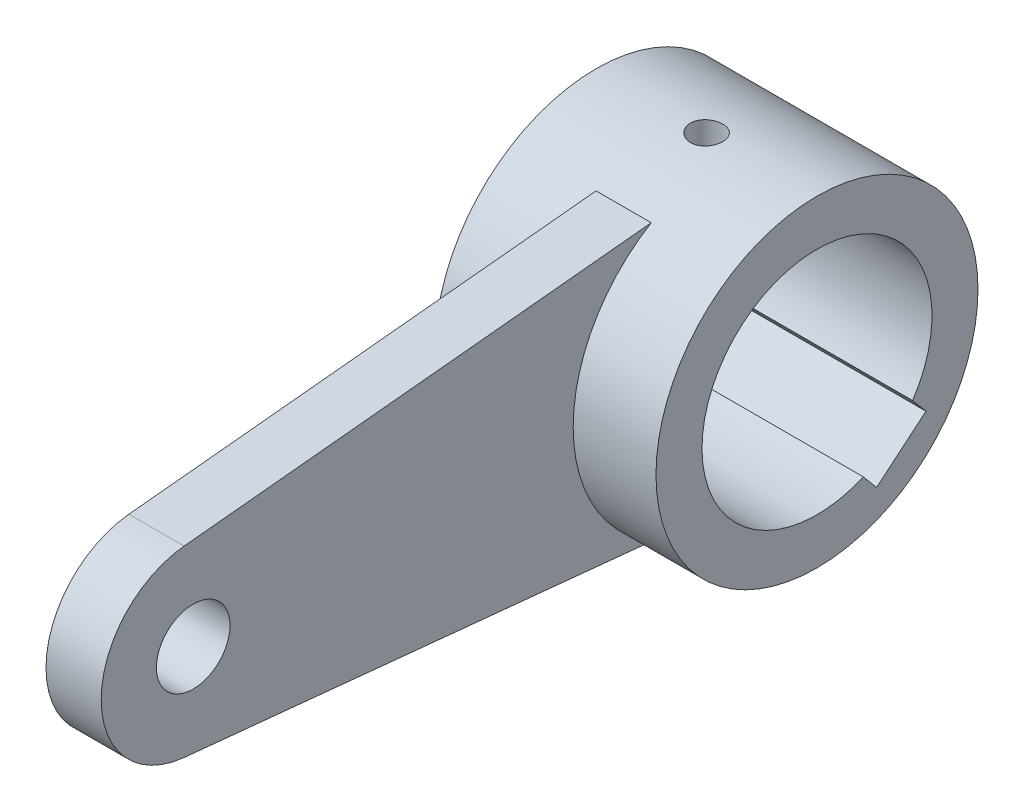
ISO-10303-21;
HEADER;
FILE_DESCRIPTION(('STEP AP214'),'2;1');
FILE_NAME('part.step','',(''),(''),'','','');
FILE_SCHEMA(('AUTOMOTIVE_DESIGN { 1 0 10303 214 1 1 1 1 }'));
ENDSEC;
DATA;
#1=APPLICATION_CONTEXT('core data for automotive mechanical design processes');
#2=APPLICATION_PROTOCOL_DEFINITION('international standard','automotive_design',2000,#1);
#3=PRODUCT_CONTEXT('',#1,'mechanical');
#4=PRODUCT('Part','Part','',(#3));
#5=PRODUCT_RELATED_PRODUCT_CATEGORY('part','',(#4));
#6=PRODUCT_DEFINITION_FORMATION('','',#4);
#7=PRODUCT_DEFINITION_CONTEXT('part definition',#1,'design');
#8=PRODUCT_DEFINITION('design','',#6,#7);
#9=PRODUCT_DEFINITION_SHAPE('','',#8);
#10=(LENGTH_UNIT() NAMED_UNIT(*) SI_UNIT(.MILLI.,.METRE.));
#11=(NAMED_UNIT(*) PLANE_ANGLE_UNIT() SI_UNIT($,.RADIAN.));
#12=(NAMED_UNIT(*) SI_UNIT($,.STERADIAN.) SOLID_ANGLE_UNIT());
#13=UNCERTAINTY_MEASURE_WITH_UNIT(LENGTH_MEASURE(1.E-05),#10,'distance_accuracy_value','');
#14=(GEOMETRIC_REPRESENTATION_CONTEXT(3) GLOBAL_UNCERTAINTY_ASSIGNED_CONTEXT((#13)) GLOBAL_UNIT_ASSIGNED_CONTEXT((#10,
#11,#12)) REPRESENTATION_CONTEXT('',''));
#15=CARTESIAN_POINT('',(0.,0.,0.));
#16=DIRECTION('',(0.,0.,1.));
#17=DIRECTION('',(1.,0.,0.));
#18=AXIS2_PLACEMENT_3D('',#15,#16,#17);
#19=CARTESIAN_POINT('',(24.,0.,0.));
#20=DIRECTION('',(1.,0.,0.));
#21=DIRECTION('',(0.,0.,-1.));
#22=AXIS2_PLACEMENT_3D('',#19,#20,#21);
#23=PLANE('',#22);
#24=DIRECTION('',(0.,0.76604444311897,0.642787609686549));
#25=VECTOR('',#24,1.);
#26=CARTESIAN_POINT('',(24.,-6.65561581062619,-14.7225757972803));
#27=LINE('',#26,#25);
#28=CARTESIAN_POINT('',(24.,-17.3327533610848,-23.6817579778994));
#29=VERTEX_POINT('',#28);
#30=CARTESIAN_POINT('',(24.,-13.8855533670494,-20.78921373431));
#31=VERTEX_POINT('',#30);
#32=EDGE_CURVE('E130',#29,#31,#27,.T.);
#33=ORIENTED_EDGE('',*,*,#32,.F.);
#34=DIRECTION('',(0.,0.642787609686549,-0.76604444311897));
#35=VECTOR('',#34,1.);
#36=CARTESIAN_POINT('',(24.,-17.3327533610848,-23.6817579778994));
#37=LINE('',#36,#35);
#38=CARTESIAN_POINT('',(24.,-26.3317798966965,-12.9571357742339));
#39=VERTEX_POINT('',#38);
#40=EDGE_CURVE('E126',#39,#29,#37,.T.);
#41=ORIENTED_EDGE('',*,*,#40,.F.);
#42=DIRECTION('',(0.,-0.76604444311897,-0.642787609686549));
#43=VECTOR('',#42,1.);
#44=CARTESIAN_POINT('',(24.,-26.3317798966965,-12.9571357742339));
#45=LINE('',#44,#43);
#46=CARTESIAN_POINT('',(24.,-22.8845799026611,-10.0645915306444));
#47=VERTEX_POINT('',#46);
#48=EDGE_CURVE('E107',#47,#39,#45,.T.);
#49=ORIENTED_EDGE('',*,*,#48,.F.);
#50=CARTESIAN_POINT('',(24.,0.,0.));
#51=DIRECTION('',(1.,0.,0.));
#52=DIRECTION('',(0.,0.,-1.));
#53=AXIS2_PLACEMENT_3D('',#50,#51,#52);
#54=CIRCLE('',#53,25.);
#55=EDGE_CURVE('E168',#31,#47,#54,.T.);
#56=ORIENTED_EDGE('',*,*,#55,.F.);
#57=EDGE_LOOP('',(#33,#41,#49,#56));
#58=FACE_BOUND('',#57,.T.);
#59=CARTESIAN_POINT('',(24.,0.,0.));
#60=DIRECTION('',(1.,0.,0.));
#61=DIRECTION('',(0.,0.,-1.));
#62=AXIS2_PLACEMENT_3D('',#59,#60,#61);
#63=CIRCLE('',#62,35.);
#64=CARTESIAN_POINT('',(24.,0.,-35.));
#65=VERTEX_POINT('',#64);
#66=EDGE_CURVE('E173',#65,#65,#63,.T.);
#67=ORIENTED_EDGE('',*,*,#66,.T.);
#68=EDGE_LOOP('',(#67));
#69=FACE_BOUND('',#68,.T.);
#70=ADVANCED_FACE('F34',(#58,#69),#23,.T.);
#71=CARTESIAN_POINT('',(-24.,0.,0.));
#72=DIRECTION('',(1.,0.,0.));
#73=DIRECTION('',(0.,0.,-1.));
#74=AXIS2_PLACEMENT_3D('',#71,#72,#73);
#75=PLANE('',#74);
#76=CARTESIAN_POINT('',(-24.,0.,0.));
#77=DIRECTION('',(1.,0.,0.));
#78=DIRECTION('',(0.,0.,-1.));
#79=AXIS2_PLACEMENT_3D('',#76,#77,#78);
#80=CIRCLE('',#79,35.);
#81=CARTESIAN_POINT('',(-24.,0.,-35.));
#82=VERTEX_POINT('',#81);
#83=EDGE_CURVE('E171',#82,#82,#80,.T.);
#84=ORIENTED_EDGE('',*,*,#83,.F.);
#85=EDGE_LOOP('',(#84));
#86=FACE_BOUND('',#85,.T.);
#87=DIRECTION('',(0.,0.642787609686549,-0.76604444311897));
#88=VECTOR('',#87,1.);
#89=CARTESIAN_POINT('',(-24.,-17.3327533610848,-23.6817579778994));
#90=LINE('',#89,#88);
#91=CARTESIAN_POINT('',(-24.,-26.3317798966965,-12.9571357742339));
#92=VERTEX_POINT('',#91);
#93=CARTESIAN_POINT('',(-24.,-17.3327533610848,-23.6817579778994));
#94=VERTEX_POINT('',#93);
#95=EDGE_CURVE('E112',#92,#94,#90,.T.);
#96=ORIENTED_EDGE('',*,*,#95,.T.);
#97=DIRECTION('',(0.,0.76604444311897,0.642787609686549));
#98=VECTOR('',#97,1.);
#99=CARTESIAN_POINT('',(-24.,-6.65561581062619,-14.7225757972803));
#100=LINE('',#99,#98);
#101=CARTESIAN_POINT('',(-24.,-13.8855533670494,-20.78921373431));
#102=VERTEX_POINT('',#101);
#103=EDGE_CURVE('E124',#94,#102,#100,.T.);
#104=ORIENTED_EDGE('',*,*,#103,.T.);
#105=CARTESIAN_POINT('',(-24.,0.,0.));
#106=DIRECTION('',(1.,0.,0.));
#107=DIRECTION('',(0.,0.,-1.));
#108=AXIS2_PLACEMENT_3D('',#105,#106,#107);
#109=CIRCLE('',#108,25.);
#110=CARTESIAN_POINT('',(-24.,-22.8845799026611,-10.0645915306444));
#111=VERTEX_POINT('',#110);
#112=EDGE_CURVE('E123',#102,#111,#109,.T.);
#113=ORIENTED_EDGE('',*,*,#112,.T.);
#114=DIRECTION('',(0.,-0.76604444311897,-0.642787609686549));
#115=VECTOR('',#114,1.);
#116=CARTESIAN_POINT('',(-24.,-26.3317798966965,-12.9571357742339));
#117=LINE('',#116,#115);
#118=EDGE_CURVE('E56',#111,#92,#117,.T.);
#119=ORIENTED_EDGE('',*,*,#118,.T.);
#120=EDGE_LOOP('',(#96,#104,#113,#119));
#121=FACE_BOUND('',#120,.T.);
#122=ADVANCED_FACE('F121',(#86,#121),#75,.F.);
#123=CARTESIAN_POINT('',(24.,0.,0.));
#124=DIRECTION('',(-1.,0.,0.));
#125=DIRECTION('',(0.,0.,1.));
#126=AXIS2_PLACEMENT_3D('',#123,#124,#125);
#127=CYLINDRICAL_SURFACE('',#126,35.);
#128=CARTESIAN_POINT('',(0.,34.8245602987317,3.49999999999988));
#129=CARTESIAN_POINT('',(-0.196068474615196,34.8245625976248,3.4999915068767));
#130=CARTESIAN_POINT('',(-0.392266589464245,34.8262339934706,3.48346900643453));
#131=CARTESIAN_POINT('',(-0.779223152048499,34.8327380631546,3.41780710166835));
#132=CARTESIAN_POINT('',(-0.969975363135411,34.8375742207731,3.36863175210201));
#133=CARTESIAN_POINT('',(-1.34038036725521,34.8498546570279,3.23911040624265));
#134=CARTESIAN_POINT('',(-1.52003981286804,34.8572973542366,3.15878330702893));
#135=CARTESIAN_POINT('',(-1.86328727302312,34.8739503199148,2.96927493586832));
#136=CARTESIAN_POINT('',(-2.02687847069355,34.883160237225,2.86009939469051));
#137=CARTESIAN_POINT('',(-2.33397942280071,34.9023474348731,2.61556666699545));
#138=CARTESIAN_POINT('',(-2.4774225332631,34.9123271001915,2.48012596337881));
#139=CARTESIAN_POINT('',(-2.73958163151263,34.931907683243,2.18708600361832));
#140=CARTESIAN_POINT('',(-2.85829648792213,34.9415085836306,2.02948573417286));
#141=CARTESIAN_POINT('',(-3.06785939952499,34.9592734104481,1.69619226577834));
#142=CARTESIAN_POINT('',(-3.15864849577781,34.9674342813132,1.52046181885337));
#143=CARTESIAN_POINT('',(-3.3094055160204,34.9813735906515,1.15615494500616));
#144=CARTESIAN_POINT('',(-3.36937419129314,34.9871520871971,0.967578831338643));
#145=CARTESIAN_POINT('',(-3.45659268273637,34.995658829986,0.583606739600202));
#146=CARTESIAN_POINT('',(-3.48395191462481,34.9983972744986,0.388235844610414));
#147=CARTESIAN_POINT('',(-3.50551344196801,35.0005500459542,-0.00434259241142233));
#148=CARTESIAN_POINT('',(-3.49971659711196,34.9999644590845,-0.201550086690736));
#149=CARTESIAN_POINT('',(-3.45521934572445,34.9955434958915,-0.591460954226082));
#150=CARTESIAN_POINT('',(-3.41663659552638,34.99171974031,-0.784177904772548));
#151=CARTESIAN_POINT('',(-3.30784604868683,34.9812655242726,-1.16038712826599));
#152=CARTESIAN_POINT('',(-3.2376378412435,34.9746350273584,-1.34387928135217));
#153=CARTESIAN_POINT('',(-3.06746032860946,34.959292811937,-1.69680110137867));
#154=CARTESIAN_POINT('',(-2.96743895864445,34.9505774578015,-1.8662054984359));
#155=CARTESIAN_POINT('',(-2.74051216832271,34.9320434581793,-2.1858672961098));
#156=CARTESIAN_POINT('',(-2.61360595949186,34.9222247803384,-2.33612413496302));
#157=CARTESIAN_POINT('',(-2.33585019670224,34.9025352713748,-2.61391470137953));
#158=CARTESIAN_POINT('',(-2.18489829340448,34.892664400056,-2.74134611166633));
#159=CARTESIAN_POINT('',(-1.86369097176228,34.8740258974878,-2.96907637375283));
#160=CARTESIAN_POINT('',(-1.6934355254175,34.8652582678387,-3.06937518619524));
#161=CARTESIAN_POINT('',(-1.33837541180073,34.8498181329952,-3.23999264600643));
#162=CARTESIAN_POINT('',(-1.15356768651989,34.8431460696394,-3.31030497200548));
#163=CARTESIAN_POINT('',(-0.77468788384859,34.8326615654828,-3.41887257473168));
#164=CARTESIAN_POINT('',(-0.580616088893944,34.8288490375619,-3.45712882810074));
#165=CARTESIAN_POINT('',(-0.189615371646723,34.8245303184596,-3.50036671387198));
#166=CARTESIAN_POINT('',(0.00729757092691552,34.8240099041661,-3.50549148826536));
#167=CARTESIAN_POINT('',(0.39917943038002,34.826296797417,-3.48269686404989));
#168=CARTESIAN_POINT('',(0.594148373491285,34.8291040599971,-3.45477791193426));
#169=CARTESIAN_POINT('',(0.976190537974195,34.8377170547841,-3.36680811077644));
#170=CARTESIAN_POINT('',(1.16327949883131,34.8435164700471,-3.3068249451613));
#171=CARTESIAN_POINT('',(1.52474018105607,34.8574551863578,-3.15649851886591));
#172=CARTESIAN_POINT('',(1.69911161100514,34.8655945410034,-3.06615456274268));
#173=CARTESIAN_POINT('',(2.03083990910072,34.88333045245,-2.85731250498138));
#174=CARTESIAN_POINT('',(2.18813679688189,34.8929318785135,-2.73871954944254));
#175=CARTESIAN_POINT('',(2.48064268645923,34.9124941418815,-2.47688186707923));
#176=CARTESIAN_POINT('',(2.61585114119027,34.9224549880803,-2.33363652986859));
#177=CARTESIAN_POINT('',(2.86083571689332,34.9416566747256,-2.02593931479278));
#178=CARTESIAN_POINT('',(2.97051845855177,34.9508947919416,-1.8614128958932));
#179=CARTESIAN_POINT('',(3.16069553977244,34.9675704737321,-1.51619201096008));
#180=CARTESIAN_POINT('',(3.24119027927486,34.9750080629773,-1.33549776650381));
#181=CARTESIAN_POINT('',(3.37054818679367,34.9872323644902,-0.963396442514975));
#182=CARTESIAN_POINT('',(3.41946775563825,34.9920238011977,-0.77200913177498));
#183=CARTESIAN_POINT('',(3.48447074352945,34.9984353114778,-0.383686848942998));
#184=CARTESIAN_POINT('',(3.50055508541913,35.0000554741798,-0.186752032922882));
#185=CARTESIAN_POINT('',(3.4994180674602,34.9999418409643,0.206157784264988));
#186=CARTESIAN_POINT('',(3.48234167107171,34.998222643183,0.402133225285718));
#187=CARTESIAN_POINT('',(3.41567189020057,34.9916522752161,0.788416609247154));
#188=CARTESIAN_POINT('',(3.36607848019455,34.9868011025722,0.978724547739183));
#189=CARTESIAN_POINT('',(3.23582259912479,34.974510333487,1.34826968068696));
#190=CARTESIAN_POINT('',(3.15516436573066,34.9670710901076,1.52750838127113));
#191=CARTESIAN_POINT('',(2.96508390879036,34.9504334345765,1.86992610054176));
#192=CARTESIAN_POINT('',(2.8556618535503,34.9412350327182,2.03310521319019));
#193=CARTESIAN_POINT('',(2.61061633341766,34.9220614633941,2.33951453549381));
#194=CARTESIAN_POINT('',(2.47488494314616,34.9120832010391,2.48265824176625));
#195=CARTESIAN_POINT('',(2.18128626958798,34.8925006770235,2.74420215787719));
#196=CARTESIAN_POINT('',(2.0234136818972,34.882896505691,2.86259642147227));
#197=CARTESIAN_POINT('',(1.68957480328959,34.8651234190513,3.07151824148024));
#198=CARTESIAN_POINT('',(1.51356351540338,34.8569582161914,3.16197415796529));
#199=CARTESIAN_POINT('',(1.14888098067601,34.8430318155411,3.31192647832916));
#200=CARTESIAN_POINT('',(0.960224286269832,34.8372679076444,3.37145780261068));
#201=CARTESIAN_POINT('',(0.642082906848253,34.8302502639813,3.44302590916929));
#202=CARTESIAN_POINT('',(0.514632120425643,34.828126617742,3.4643619933941));
#203=CARTESIAN_POINT('',(0.258139619352917,34.8252808812256,3.49285180511734));
#204=CARTESIAN_POINT('',(0.129097911383504,34.8245587850651,3.50000559215061));
#205=CARTESIAN_POINT('',(0.,34.8245602987317,3.49999999999988));
#206=B_SPLINE_CURVE_WITH_KNOTS('',3,(#128,#129,#130,#131,#132,#133,#134,#135,#136,#137,#138,
#139,#140,#141,#142,#143,#144,#145,#146,#147,#148,#149,#150,#151,#152,#153,#154,#155,#156,#157,
#158,#159,#160,#161,#162,#163,#164,#165,#166,#167,#168,#169,#170,#171,#172,#173,#174,#175,#176,
#177,#178,#179,#180,#181,#182,#183,#184,#185,#186,#187,#188,#189,#190,#191,#192,#193,#194,#195,
#196,#197,#198,#199,#200,#201,#202,#203,#204,#205),.UNSPECIFIED.,.T.,.F.,(4,2,2,2,2,2,2,2,2,2,2,
2,2,2,2,2,2,2,2,2,2,2,2,2,2,2,2,2,2,2,2,2,2,2,2,2,2,2,4),(0.,0.58773398053861,1.17611603139755,
1.76414171851251,2.35205068149596,2.94186065356873,3.53169760495521,4.12277144901656,
4.71383088429417,5.30290148146709,5.89195680495949,6.47890711367451,7.06586504685546,
7.65385409134583,8.24186038266986,8.8324398779964,9.42302022998605,10.013725019149,
10.6044118108475,11.1925448707931,11.7806699838618,12.3675585146798,12.954460489658,
13.5433616434315,14.1322773803334,14.7233147886555,15.3143440981515,15.904314744324,
16.4942688089816,17.0816496714183,17.6690309949044,18.256332219855,18.8436300083993,
19.4333900263509,20.0232915762297,20.6146934374943,21.2054260213252,21.5924109662468,
21.9793942866687),.UNSPECIFIED.);
#207=CARTESIAN_POINT('',(0.,34.8245602987317,3.49999999999988));
#208=VERTEX_POINT('',#207);
#209=EDGE_CURVE('E132',#208,#208,#206,.T.);
#210=ORIENTED_EDGE('',*,*,#209,.T.);
#211=EDGE_LOOP('',(#210));
#212=FACE_BOUND('',#211,.T.);
#213=DIRECTION('',(-1.,0.,0.));
#214=VECTOR('',#213,1.);
#215=CARTESIAN_POINT('',(6.,30.,18.02775637732));
#216=LINE('',#215,#214);
#217=CARTESIAN_POINT('',(6.,30.,18.02775637732));
#218=VERTEX_POINT('',#217);
#219=CARTESIAN_POINT('',(-6.,30.,18.02775637732));
#220=VERTEX_POINT('',#219);
#221=EDGE_CURVE('E64',#218,#220,#216,.T.);
#222=ORIENTED_EDGE('',*,*,#221,.F.);
#223=CARTESIAN_POINT('',(6.,0.,0.));
#224=DIRECTION('',(-1.,0.,0.));
#225=DIRECTION('',(0.,0.,-1.));
#226=AXIS2_PLACEMENT_3D('',#223,#224,#225);
#227=CIRCLE('',#226,35.);
#228=CARTESIAN_POINT('',(6.,-30.,18.02775637732));
#229=VERTEX_POINT('',#228);
#230=EDGE_CURVE('E140',#229,#218,#227,.T.);
#231=ORIENTED_EDGE('',*,*,#230,.F.);
#232=DIRECTION('',(-1.,0.,0.));
#233=VECTOR('',#232,1.);
#234=CARTESIAN_POINT('',(6.,-30.,18.02775637732));
#235=LINE('',#234,#233);
#236=CARTESIAN_POINT('',(-6.,-30.,18.02775637732));
#237=VERTEX_POINT('',#236);
#238=EDGE_CURVE('E151',#229,#237,#235,.T.);
#239=ORIENTED_EDGE('',*,*,#238,.T.);
#240=CARTESIAN_POINT('',(-6.,0.,0.));
#241=DIRECTION('',(-1.,0.,0.));
#242=DIRECTION('',(0.,0.,-1.));
#243=AXIS2_PLACEMENT_3D('',#240,#241,#242);
#244=CIRCLE('',#243,35.);
#245=EDGE_CURVE('E152',#237,#220,#244,.T.);
#246=ORIENTED_EDGE('',*,*,#245,.T.);
#247=EDGE_LOOP('',(#222,#231,#239,#246));
#248=FACE_BOUND('',#247,.T.);
#249=ORIENTED_EDGE('',*,*,#66,.F.);
#250=EDGE_LOOP('',(#249));
#251=FACE_BOUND('',#250,.T.);
#252=ORIENTED_EDGE('',*,*,#83,.T.);
#253=EDGE_LOOP('',(#252));
#254=FACE_BOUND('',#253,.T.);
#255=ADVANCED_FACE('F36',(#212,#248,#251,#254),#127,.T.);
#256=CARTESIAN_POINT('',(24.,0.,0.));
#257=DIRECTION('',(-1.,0.,0.));
#258=DIRECTION('',(0.,0.,1.));
#259=AXIS2_PLACEMENT_3D('',#256,#257,#258);
#260=CYLINDRICAL_SURFACE('',#259,25.);
#261=CARTESIAN_POINT('',(0.,24.7537875889731,3.49999999999991));
#262=CARTESIAN_POINT('',(-0.195560154767575,24.7537906822583,3.49999181655899));
#263=CARTESIAN_POINT('',(-0.391237507482555,24.7561300920155,3.48355443558917));
#264=CARTESIAN_POINT('',(-0.777131922734741,24.76522981384,3.41825061741048));
#265=CARTESIAN_POINT('',(-0.967343298780199,24.7719945675026,3.36935159862291));
#266=CARTESIAN_POINT('',(-1.33666359330411,24.7891640928697,3.2406069700329));
#267=CARTESIAN_POINT('',(-1.51578050601989,24.7995662068558,3.16078395095821));
#268=CARTESIAN_POINT('',(-1.85804877360261,24.8228352266466,2.97250847563916));
#269=CARTESIAN_POINT('',(-2.02120254431549,24.8357017586143,2.86406036070275));
#270=CARTESIAN_POINT('',(-2.32808215853283,24.8625504844522,2.62080281251517));
#271=CARTESIAN_POINT('',(-2.47168026194528,24.8765391460462,2.48583292443012));
#272=CARTESIAN_POINT('',(-2.73426680506273,24.9039980636581,2.1937092685364));
#273=CARTESIAN_POINT('',(-2.85325394710894,24.9174682923102,2.03655433171439));
#274=CARTESIAN_POINT('',(-3.06370718457442,24.9424397352459,1.7037092427827));
#275=CARTESIAN_POINT('',(-3.15505643492662,24.9539325035401,1.5279445235744));
#276=CARTESIAN_POINT('',(-3.30689160701615,24.9735826810557,1.16337996516009));
#277=CARTESIAN_POINT('',(-3.36737895417656,24.9817402443171,0.974580728438527));
#278=CARTESIAN_POINT('',(-3.45538823852594,24.9937552741093,0.590618783329255));
#279=CARTESIAN_POINT('',(-3.48312354003459,24.9976405609784,0.39550586551262));
#280=CARTESIAN_POINT('',(-3.50550340939038,25.0007684801016,0.00335922712109844));
#281=CARTESIAN_POINT('',(-3.50014959052891,25.0000113387018,-0.193674399340166));
#282=CARTESIAN_POINT('',(-3.45667267130987,24.9939620558024,-0.582615400058849));
#283=CARTESIAN_POINT('',(-3.41877908235907,24.9887016775951,-0.77454899363336));
#284=CARTESIAN_POINT('',(-3.31165791632868,24.9742724352295,-1.1493059403018));
#285=CARTESIAN_POINT('',(-3.2424296191148,24.9651034812448,-1.33212908391216));
#286=CARTESIAN_POINT('',(-3.07436539311271,24.9438325860369,-1.68417680329696));
#287=CARTESIAN_POINT('',(-2.97543170896317,24.9317209865754,-1.85335410431128));
#288=CARTESIAN_POINT('',(-2.75083632806707,24.9059168552186,-2.17279223786532));
#289=CARTESIAN_POINT('',(-2.6251730960448,24.8922242325342,-2.32305198304032));
#290=CARTESIAN_POINT('',(-2.34940423165519,24.8646488503525,-2.60174071972411));
#291=CARTESIAN_POINT('',(-2.19909835937842,24.8507654670317,-2.72997158820316));
#292=CARTESIAN_POINT('',(-1.87899432350826,24.8244883316295,-2.95941854341821));
#293=CARTESIAN_POINT('',(-1.70919606731678,24.8120945866252,-3.06063450181293));
#294=CARTESIAN_POINT('',(-1.35473337110271,24.7902003566841,-3.23319870278271));
#295=CARTESIAN_POINT('',(-1.17005982427998,24.7807016614096,-3.30452848048132));
#296=CARTESIAN_POINT('',(-0.791192209672886,24.7657059743542,-3.41510621643369));
#297=CARTESIAN_POINT('',(-0.596998723344254,24.7602087384978,-3.45435613146944));
#298=CARTESIAN_POINT('',(-0.206360947689206,24.7538840422246,-3.49939221005379));
#299=CARTESIAN_POINT('',(-0.00994954822496354,24.7530175108533,-3.50545836748379));
#300=CARTESIAN_POINT('',(0.381086893072054,24.755948778245,-3.48469592776285));
#301=CARTESIAN_POINT('',(0.575711982828229,24.7597464515054,-3.45786821570808));
#302=CARTESIAN_POINT('',(0.956795666068332,24.7715424400724,-3.37231633400967));
#303=CARTESIAN_POINT('',(1.14328581530875,24.7795225973313,-3.3137300054231));
#304=CARTESIAN_POINT('',(1.50379762778359,24.7987695354145,-3.16646669264694));
#305=CARTESIAN_POINT('',(1.67781874866506,24.8100364590921,-3.07778840053819));
#306=CARTESIAN_POINT('',(2.00971273491393,24.8346801452907,-2.87217909544431));
#307=CARTESIAN_POINT('',(2.16747168569053,24.8480703159863,-2.75506583601389));
#308=CARTESIAN_POINT('',(2.4611957887449,24.875410682501,-2.49616615385776));
#309=CARTESIAN_POINT('',(2.59715987130254,24.8893609057662,-2.35437852079399));
#310=CARTESIAN_POINT('',(2.84443100323985,24.9163707911093,-2.04892599936437));
#311=CARTESIAN_POINT('',(2.95555315271703,24.9294233048069,-1.8851107059176));
#312=CARTESIAN_POINT('',(3.14870159069414,24.9530578482668,-1.54097657080121));
#313=CARTESIAN_POINT('',(3.2307285895544,24.9636399383426,-1.36065813219238));
#314=CARTESIAN_POINT('',(3.36305865647722,24.9811098395859,-0.989229139282875));
#315=CARTESIAN_POINT('',(3.4134652371279,24.9880096937281,-0.798156053861498));
#316=CARTESIAN_POINT('',(3.4814593912701,24.9973880303632,-0.410154489530087));
#317=CARTESIAN_POINT('',(3.49904884140295,24.9998667656766,-0.21322634609474));
#318=CARTESIAN_POINT('',(3.5008681558451,25.000121613377,0.179096941501349));
#319=CARTESIAN_POINT('',(3.48538184019311,24.9979377352712,0.374490803444288));
#320=CARTESIAN_POINT('',(3.42209452891469,24.9891929064383,0.759868138965443));
#321=CARTESIAN_POINT('',(3.37429359967922,24.9826319647038,0.949851623658541));
#322=CARTESIAN_POINT('',(3.24782988921627,24.9658667061347,1.31895434116059));
#323=CARTESIAN_POINT('',(3.16918424064728,24.9556644121669,1.49807954152811));
#324=CARTESIAN_POINT('',(2.98329332105218,24.9327408556312,1.84063575824949));
#325=CARTESIAN_POINT('',(2.87604736542495,24.9200195327676,2.00406639879774));
#326=CARTESIAN_POINT('',(2.63496342765128,24.8933445340092,2.31203862615948));
#327=CARTESIAN_POINT('',(2.50091509911646,24.8793816286934,2.45641476524119));
#328=CARTESIAN_POINT('',(2.21047306678788,24.8518678878302,2.72072938480244));
#329=CARTESIAN_POINT('',(2.05407411017749,24.8383171500605,2.84066210449918));
#330=CARTESIAN_POINT('',(1.72248429059404,24.8130916210476,3.05319975931045));
#331=CARTESIAN_POINT('',(1.54720581657095,24.801426264232,3.14566908745307));
#332=CARTESIAN_POINT('',(1.18353239989126,24.7814027288131,3.29972220584228));
#333=CARTESIAN_POINT('',(0.995151587980839,24.7730410503233,3.36133869990577));
#334=CARTESIAN_POINT('',(0.671556886996481,24.7625452599898,3.43762752385736));
#335=CARTESIAN_POINT('',(0.538360644804012,24.759278094514,3.46098233554839));
#336=CARTESIAN_POINT('',(0.270128231058788,24.7548982019194,3.49217131855808));
#337=CARTESIAN_POINT('',(0.13509207886887,24.7537854521456,3.50000565308425));
#338=CARTESIAN_POINT('',(0.,24.7537875889731,3.49999999999991));
#339=B_SPLINE_CURVE_WITH_KNOTS('',3,(#261,#262,#263,#264,#265,#266,#267,#268,#269,#270,#271,
#272,#273,#274,#275,#276,#277,#278,#279,#280,#281,#282,#283,#284,#285,#286,#287,#288,#289,#290,
#291,#292,#293,#294,#295,#296,#297,#298,#299,#300,#301,#302,#303,#304,#305,#306,#307,#308,#309,
#310,#311,#312,#313,#314,#315,#316,#317,#318,#319,#320,#321,#322,#323,#324,#325,#326,#327,#328,
#329,#330,#331,#332,#333,#334,#335,#336,#337,#338),.UNSPECIFIED.,.T.,.F.,(4,2,2,2,2,2,2,2,2,2,2,
2,2,2,2,2,2,2,2,2,2,2,2,2,2,2,2,2,2,2,2,2,2,2,2,2,2,2,4),(0.,0.586186802715839,1.17296284945572,
1.75931104800062,2.34557037149055,2.93549224141235,3.52544520813938,4.11785855282521,
4.71024453315484,5.29874972351533,5.88722622097413,6.47158581791365,7.05595884528782,
7.64227642364724,8.22862768766166,8.82000392576343,9.41138297329996,10.0031268615642,
10.5948346524106,11.1815420123042,11.7682335856381,12.3523989110571,12.9365896299306,
13.5246282706496,14.1126957642295,14.7050044334248,15.2972986403631,15.887643653788,
16.4779549074112,17.0632211173544,17.6484861248614,18.233426507049,18.8183808921209,
19.4081201968966,19.997998330098,20.5907424672804,21.1828569621121,21.58779643772,
21.9927316551138),.UNSPECIFIED.);
#340=CARTESIAN_POINT('',(0.,24.7537875889731,3.49999999999991));
#341=VERTEX_POINT('',#340);
#342=EDGE_CURVE('E39',#341,#341,#339,.T.);
#343=ORIENTED_EDGE('',*,*,#342,.F.);
#344=EDGE_LOOP('',(#343));
#345=FACE_BOUND('',#344,.T.);
#346=DIRECTION('',(-1.,0.,0.));
#347=VECTOR('',#346,1.);
#348=CARTESIAN_POINT('',(24.,-13.8855533670494,-20.78921373431));
#349=LINE('',#348,#347);
#350=EDGE_CURVE('E11',#31,#102,#349,.T.);
#351=ORIENTED_EDGE('',*,*,#350,.F.);
#352=ORIENTED_EDGE('',*,*,#55,.T.);
#353=DIRECTION('',(-1.,0.,0.));
#354=VECTOR('',#353,1.);
#355=CARTESIAN_POINT('',(24.,-22.8845799026611,-10.0645915306444));
#356=LINE('',#355,#354);
#357=EDGE_CURVE('E49',#111,#47,#356,.F.);
#358=ORIENTED_EDGE('',*,*,#357,.F.);
#359=ORIENTED_EDGE('',*,*,#112,.F.);
#360=EDGE_LOOP('',(#351,#352,#358,#359));
#361=FACE_BOUND('',#360,.T.);
#362=ADVANCED_FACE('F186',(#345,#361),#260,.F.);
#363=CARTESIAN_POINT('',(6.,30.,18.02775637732));
#364=DIRECTION('',(0.,-0.995092310823553,-0.0989509622987179));
#365=DIRECTION('',(0.,0.0989509622987179,-0.995092310823553));
#366=AXIS2_PLACEMENT_3D('',#363,#364,#365);
#367=PLANE('',#366);
#368=DIRECTION('',(0.,-0.0989509622987179,0.995092310823552));
#369=VECTOR('',#368,1.);
#370=CARTESIAN_POINT('',(-6.,30.,18.02775637732));
#371=LINE('',#370,#369);
#372=CARTESIAN_POINT('',(-6.,19.9018462164711,119.579019245974));
#373=VERTEX_POINT('',#372);
#374=EDGE_CURVE('E154',#220,#373,#371,.T.);
#375=ORIENTED_EDGE('',*,*,#374,.T.);
#376=DIRECTION('',(-1.,0.,0.));
#377=VECTOR('',#376,1.);
#378=CARTESIAN_POINT('',(6.,19.9018462164711,119.579019245974));
#379=LINE('',#378,#377);
#380=CARTESIAN_POINT('',(6.,19.9018462164711,119.579019245974));
#381=VERTEX_POINT('',#380);
#382=EDGE_CURVE('E164',#381,#373,#379,.T.);
#383=ORIENTED_EDGE('',*,*,#382,.F.);
#384=DIRECTION('',(0.,-0.0989509622987179,0.995092310823552));
#385=VECTOR('',#384,1.);
#386=CARTESIAN_POINT('',(6.,30.,18.02775637732));
#387=LINE('',#386,#385);
#388=EDGE_CURVE('E143',#218,#381,#387,.T.);
#389=ORIENTED_EDGE('',*,*,#388,.F.);
#390=ORIENTED_EDGE('',*,*,#221,.T.);
#391=EDGE_LOOP('',(#375,#383,#389,#390));
#392=FACE_BOUND('',#391,.T.);
#393=ADVANCED_FACE('F210',(#392),#367,.F.);
#394=CARTESIAN_POINT('',(6.,0.,117.6));
#395=DIRECTION('',(-1.,0.,0.));
#396=DIRECTION('',(0.,0.,1.));
#397=AXIS2_PLACEMENT_3D('',#394,#395,#396);
#398=CYLINDRICAL_SURFACE('',#397,20.);
#399=CARTESIAN_POINT('',(-6.,0.,117.6));
#400=DIRECTION('',(1.,0.,0.));
#401=DIRECTION('',(0.,0.,-1.));
#402=AXIS2_PLACEMENT_3D('',#399,#400,#401);
#403=CIRCLE('',#402,20.);
#404=CARTESIAN_POINT('',(-6.,-19.9018462164711,119.579019245974));
#405=VERTEX_POINT('',#404);
#406=EDGE_CURVE('E156',#373,#405,#403,.T.);
#407=ORIENTED_EDGE('',*,*,#406,.T.);
#408=DIRECTION('',(-1.,0.,0.));
#409=VECTOR('',#408,1.);
#410=CARTESIAN_POINT('',(6.,-19.9018462164711,119.579019245974));
#411=LINE('',#410,#409);
#412=CARTESIAN_POINT('',(6.,-19.9018462164711,119.579019245974));
#413=VERTEX_POINT('',#412);
#414=EDGE_CURVE('E161',#413,#405,#411,.T.);
#415=ORIENTED_EDGE('',*,*,#414,.F.);
#416=CARTESIAN_POINT('',(6.,0.,117.6));
#417=DIRECTION('',(1.,0.,0.));
#418=DIRECTION('',(0.,0.,-1.));
#419=AXIS2_PLACEMENT_3D('',#416,#417,#418);
#420=CIRCLE('',#419,20.);
#421=EDGE_CURVE('E146',#381,#413,#420,.T.);
#422=ORIENTED_EDGE('',*,*,#421,.F.);
#423=ORIENTED_EDGE('',*,*,#382,.T.);
#424=EDGE_LOOP('',(#407,#415,#422,#423));
#425=FACE_BOUND('',#424,.T.);
#426=ADVANCED_FACE('F214',(#425),#398,.T.);
#427=CARTESIAN_POINT('',(6.,-19.9018462164711,119.579019245974));
#428=DIRECTION('',(0.,0.995092310823553,-0.0989509622987179));
#429=DIRECTION('',(0.,0.0989509622987179,0.995092310823553));
#430=AXIS2_PLACEMENT_3D('',#427,#428,#429);
#431=PLANE('',#430);
#432=DIRECTION('',(0.,-0.0989509622987179,-0.995092310823552));
#433=VECTOR('',#432,1.);
#434=CARTESIAN_POINT('',(-6.,-19.9018462164711,119.579019245974));
#435=LINE('',#434,#433);
#436=EDGE_CURVE('E144',#405,#237,#435,.T.);
#437=ORIENTED_EDGE('',*,*,#436,.T.);
#438=ORIENTED_EDGE('',*,*,#238,.F.);
#439=DIRECTION('',(0.,-0.0989509622987179,-0.995092310823552));
#440=VECTOR('',#439,1.);
#441=CARTESIAN_POINT('',(6.,-19.9018462164711,119.579019245974));
#442=LINE('',#441,#440);
#443=EDGE_CURVE('E148',#413,#229,#442,.T.);
#444=ORIENTED_EDGE('',*,*,#443,.F.);
#445=ORIENTED_EDGE('',*,*,#414,.T.);
#446=EDGE_LOOP('',(#437,#438,#444,#445));
#447=FACE_BOUND('',#446,.T.);
#448=ADVANCED_FACE('F218',(#447),#431,.F.);
#449=CARTESIAN_POINT('',(6.,0.,0.));
#450=DIRECTION('',(1.,0.,0.));
#451=DIRECTION('',(0.,0.,-1.));
#452=AXIS2_PLACEMENT_3D('',#449,#450,#451);
#453=PLANE('',#452);
#454=CARTESIAN_POINT('',(6.,0.,117.6));
#455=DIRECTION('',(1.,0.,0.));
#456=DIRECTION('',(0.,0.,-1.));
#457=AXIS2_PLACEMENT_3D('',#454,#455,#456);
#458=CIRCLE('',#457,8.);
#459=CARTESIAN_POINT('',(6.,0.,109.6));
#460=VERTEX_POINT('',#459);
#461=EDGE_CURVE('E135',#460,#460,#458,.T.);
#462=ORIENTED_EDGE('',*,*,#461,.F.);
#463=EDGE_LOOP('',(#462));
#464=FACE_BOUND('',#463,.T.);
#465=ORIENTED_EDGE('',*,*,#230,.T.);
#466=ORIENTED_EDGE('',*,*,#388,.T.);
#467=ORIENTED_EDGE('',*,*,#421,.T.);
#468=ORIENTED_EDGE('',*,*,#443,.T.);
#469=EDGE_LOOP('',(#465,#466,#467,#468));
#470=FACE_BOUND('',#469,.T.);
#471=ADVANCED_FACE('F222',(#464,#470),#453,.T.);
#472=CARTESIAN_POINT('',(-6.,0.,0.));
#473=DIRECTION('',(1.,0.,0.));
#474=DIRECTION('',(0.,0.,-1.));
#475=AXIS2_PLACEMENT_3D('',#472,#473,#474);
#476=PLANE('',#475);
#477=CARTESIAN_POINT('',(-6.,0.,117.6));
#478=DIRECTION('',(1.,0.,0.));
#479=DIRECTION('',(0.,0.,-1.));
#480=AXIS2_PLACEMENT_3D('',#477,#478,#479);
#481=CIRCLE('',#480,8.);
#482=CARTESIAN_POINT('',(-6.,0.,109.6));
#483=VERTEX_POINT('',#482);
#484=EDGE_CURVE('E139',#483,#483,#481,.T.);
#485=ORIENTED_EDGE('',*,*,#484,.T.);
#486=EDGE_LOOP('',(#485));
#487=FACE_BOUND('',#486,.T.);
#488=ORIENTED_EDGE('',*,*,#245,.F.);
#489=ORIENTED_EDGE('',*,*,#436,.F.);
#490=ORIENTED_EDGE('',*,*,#406,.F.);
#491=ORIENTED_EDGE('',*,*,#374,.F.);
#492=EDGE_LOOP('',(#488,#489,#490,#491));
#493=FACE_BOUND('',#492,.T.);
#494=ADVANCED_FACE('F197',(#487,#493),#476,.F.);
#495=CARTESIAN_POINT('',(-9.,0.,117.6));
#496=DIRECTION('',(1.,0.,0.));
#497=DIRECTION('',(0.,0.,-1.));
#498=AXIS2_PLACEMENT_3D('',#495,#496,#497);
#499=CYLINDRICAL_SURFACE('',#498,8.);
#500=ORIENTED_EDGE('',*,*,#461,.T.);
#501=EDGE_LOOP('',(#500));
#502=FACE_BOUND('',#501,.T.);
#503=ORIENTED_EDGE('',*,*,#484,.F.);
#504=EDGE_LOOP('',(#503));
#505=FACE_BOUND('',#504,.T.);
#506=ADVANCED_FACE('F190',(#502,#505),#499,.F.);
#507=CARTESIAN_POINT('',(-24.,-6.65561581062619,-14.7225757972803));
#508=DIRECTION('',(0.,0.642787609686549,-0.76604444311897));
#509=DIRECTION('',(0.,0.76604444311897,0.642787609686549));
#510=AXIS2_PLACEMENT_3D('',#507,#508,#509);
#511=PLANE('',#510);
#512=ORIENTED_EDGE('',*,*,#350,.T.);
#513=ORIENTED_EDGE('',*,*,#103,.F.);
#514=DIRECTION('',(1.,0.,0.));
#515=VECTOR('',#514,1.);
#516=CARTESIAN_POINT('',(-24.,-17.3327533610848,-23.6817579778994));
#517=LINE('',#516,#515);
#518=EDGE_CURVE('E111',#94,#29,#517,.T.);
#519=ORIENTED_EDGE('',*,*,#518,.T.);
#520=ORIENTED_EDGE('',*,*,#32,.T.);
#521=EDGE_LOOP('',(#512,#513,#519,#520));
#522=FACE_BOUND('',#521,.T.);
#523=ADVANCED_FACE('F188',(#522),#511,.F.);
#524=CARTESIAN_POINT('',(-24.,-17.3327533610848,-23.6817579778994));
#525=DIRECTION('',(0.,-0.76604444311897,-0.642787609686549));
#526=DIRECTION('',(0.,0.642787609686549,-0.76604444311897));
#527=AXIS2_PLACEMENT_3D('',#524,#525,#526);
#528=PLANE('',#527);
#529=ORIENTED_EDGE('',*,*,#40,.T.);
#530=ORIENTED_EDGE('',*,*,#518,.F.);
#531=ORIENTED_EDGE('',*,*,#95,.F.);
#532=DIRECTION('',(1.,0.,0.));
#533=VECTOR('',#532,1.);
#534=CARTESIAN_POINT('',(-24.,-26.3317798966965,-12.9571357742339));
#535=LINE('',#534,#533);
#536=EDGE_CURVE('E103',#92,#39,#535,.T.);
#537=ORIENTED_EDGE('',*,*,#536,.T.);
#538=EDGE_LOOP('',(#529,#530,#531,#537));
#539=FACE_BOUND('',#538,.T.);
#540=ADVANCED_FACE('F115',(#539),#528,.F.);
#541=CARTESIAN_POINT('',(-24.,-26.3317798966965,-12.9571357742339));
#542=DIRECTION('',(0.,-0.642787609686549,0.76604444311897));
#543=DIRECTION('',(0.,-0.76604444311897,-0.642787609686549));
#544=AXIS2_PLACEMENT_3D('',#541,#542,#543);
#545=PLANE('',#544);
#546=ORIENTED_EDGE('',*,*,#357,.T.);
#547=ORIENTED_EDGE('',*,*,#48,.T.);
#548=ORIENTED_EDGE('',*,*,#536,.F.);
#549=ORIENTED_EDGE('',*,*,#118,.F.);
#550=EDGE_LOOP('',(#546,#547,#548,#549));
#551=FACE_BOUND('',#550,.T.);
#552=ADVANCED_FACE('F105',(#551),#545,.F.);
#553=CARTESIAN_POINT('',(0.,11.,0.));
#554=DIRECTION('',(0.,1.,0.));
#555=DIRECTION('',(0.,0.,1.));
#556=AXIS2_PLACEMENT_3D('',#553,#554,#555);
#557=CYLINDRICAL_SURFACE('',#556,3.5);
#558=ORIENTED_EDGE('',*,*,#342,.T.);
#559=EDGE_LOOP('',(#558));
#560=FACE_BOUND('',#559,.T.);
#561=ORIENTED_EDGE('',*,*,#209,.F.);
#562=EDGE_LOOP('',(#561));
#563=FACE_BOUND('',#562,.T.);
#564=ADVANCED_FACE('F258',(#560,#563),#557,.F.);
#565=CLOSED_SHELL('',(#70,#122,#255,#362,#393,#426,#448,#471,#494,#506,#523,#540,#552,#564));
#566=MANIFOLD_SOLID_BREP('B2',#565);
#567=ADVANCED_BREP_SHAPE_REPRESENTATION('',(#18,#566),#14);
#568=SHAPE_DEFINITION_REPRESENTATION(#9,#567);
ENDSEC;
END-ISO-10303-21;
